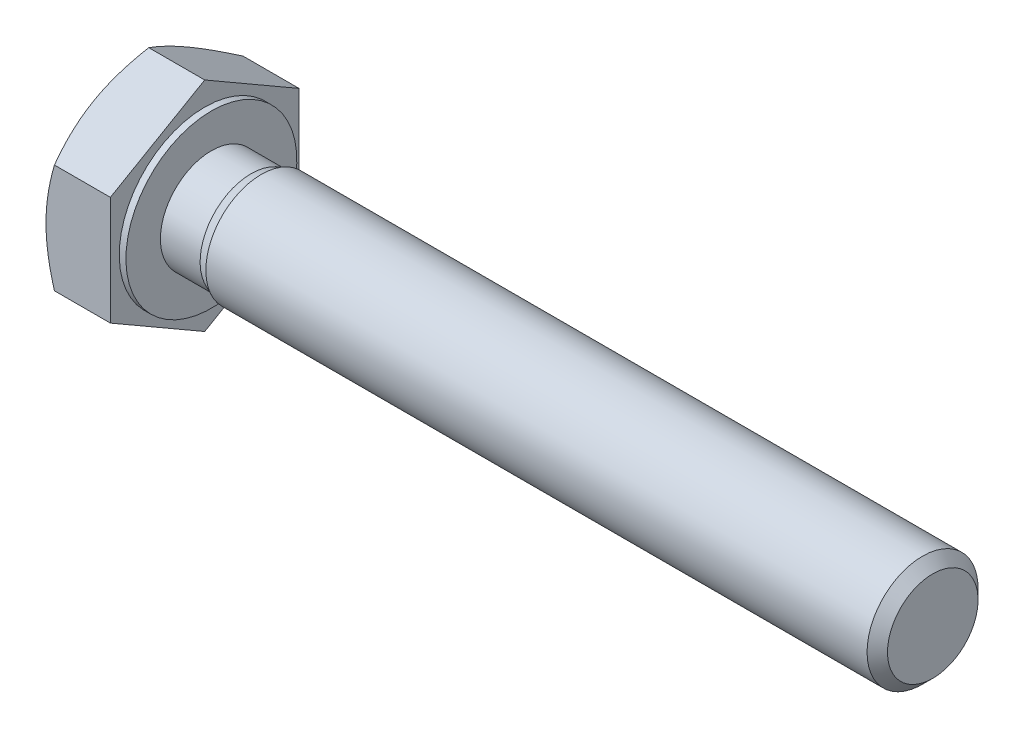
ISO-10303-21;
HEADER;
FILE_DESCRIPTION(('STEP AP214'),'2;1');
FILE_NAME('part.step','',(''),(''),'','','');
FILE_SCHEMA(('AUTOMOTIVE_DESIGN { 1 0 10303 214 1 1 1 1 }'));
ENDSEC;
DATA;
#1=APPLICATION_CONTEXT('core data for automotive mechanical design processes');
#2=APPLICATION_PROTOCOL_DEFINITION('international standard','automotive_design',2000,#1);
#3=PRODUCT_CONTEXT('',#1,'mechanical');
#4=PRODUCT('Part','Part','',(#3));
#5=PRODUCT_RELATED_PRODUCT_CATEGORY('part','',(#4));
#6=PRODUCT_DEFINITION_FORMATION('','',#4);
#7=PRODUCT_DEFINITION_CONTEXT('part definition',#1,'design');
#8=PRODUCT_DEFINITION('design','',#6,#7);
#9=PRODUCT_DEFINITION_SHAPE('','',#8);
#10=(LENGTH_UNIT() NAMED_UNIT(*) SI_UNIT(.MILLI.,.METRE.));
#11=(NAMED_UNIT(*) PLANE_ANGLE_UNIT() SI_UNIT($,.RADIAN.));
#12=(NAMED_UNIT(*) SI_UNIT($,.STERADIAN.) SOLID_ANGLE_UNIT());
#13=UNCERTAINTY_MEASURE_WITH_UNIT(LENGTH_MEASURE(1.E-05),#10,'distance_accuracy_value','');
#14=(GEOMETRIC_REPRESENTATION_CONTEXT(3) GLOBAL_UNCERTAINTY_ASSIGNED_CONTEXT((#13)) GLOBAL_UNIT_ASSIGNED_CONTEXT((#10,
#11,#12)) REPRESENTATION_CONTEXT('',''));
#15=CARTESIAN_POINT('',(0.,0.,0.));
#16=DIRECTION('',(0.,0.,1.));
#17=DIRECTION('',(1.,0.,0.));
#18=AXIS2_PLACEMENT_3D('',#15,#16,#17);
#19=CARTESIAN_POINT('',(-6.40009999999999,0.,0.));
#20=DIRECTION('',(1.,0.,0.));
#21=DIRECTION('',(0.,1.,0.));
#22=AXIS2_PLACEMENT_3D('',#19,#20,#21);
#23=PLANE('',#22);
#24=CARTESIAN_POINT('',(-6.40010000000001,0.,0.));
#25=DIRECTION('',(1.,0.,0.));
#26=DIRECTION('',(0.,0.,-1.));
#27=AXIS2_PLACEMENT_3D('',#24,#25,#26);
#28=CIRCLE('',#27,8.49999999999999);
#29=CARTESIAN_POINT('',(-6.40010000000001,7.36121593216772,-4.24999999999999));
#30=VERTEX_POINT('',#29);
#31=CARTESIAN_POINT('',(-6.40010000000001,7.36121593216772,4.25));
#32=VERTEX_POINT('',#31);
#33=EDGE_CURVE('E372',#30,#32,#28,.T.);
#34=ORIENTED_EDGE('',*,*,#33,.F.);
#35=CARTESIAN_POINT('',(-6.40010000000001,0.,0.));
#36=DIRECTION('',(1.,0.,0.));
#37=DIRECTION('',(0.,0.,-1.));
#38=AXIS2_PLACEMENT_3D('',#35,#36,#37);
#39=CIRCLE('',#38,8.49999999999999);
#40=CARTESIAN_POINT('',(-6.40010000000001,0.,-8.49999999999999));
#41=VERTEX_POINT('',#40);
#42=EDGE_CURVE('E368',#41,#30,#39,.T.);
#43=ORIENTED_EDGE('',*,*,#42,.F.);
#44=CARTESIAN_POINT('',(-6.40010000000001,0.,0.));
#45=DIRECTION('',(1.,0.,0.));
#46=DIRECTION('',(0.,0.,-1.));
#47=AXIS2_PLACEMENT_3D('',#44,#45,#46);
#48=CIRCLE('',#47,8.49999999999999);
#49=CARTESIAN_POINT('',(-6.40010000000001,-7.36121593216772,-4.25));
#50=VERTEX_POINT('',#49);
#51=EDGE_CURVE('E364',#50,#41,#48,.T.);
#52=ORIENTED_EDGE('',*,*,#51,.F.);
#53=CARTESIAN_POINT('',(-6.40010000000001,0.,0.));
#54=DIRECTION('',(1.,0.,0.));
#55=DIRECTION('',(0.,0.,-1.));
#56=AXIS2_PLACEMENT_3D('',#53,#54,#55);
#57=CIRCLE('',#56,8.49999999999999);
#58=CARTESIAN_POINT('',(-6.40010000000001,-7.36121593216773,4.24999999999999));
#59=VERTEX_POINT('',#58);
#60=EDGE_CURVE('E91',#59,#50,#57,.T.);
#61=ORIENTED_EDGE('',*,*,#60,.F.);
#62=CARTESIAN_POINT('',(-6.40010000000001,0.,0.));
#63=DIRECTION('',(1.,0.,0.));
#64=DIRECTION('',(0.,0.,-1.));
#65=AXIS2_PLACEMENT_3D('',#62,#63,#64);
#66=CIRCLE('',#65,8.49999999999999);
#67=CARTESIAN_POINT('',(-6.40010000000001,0.,8.49999999999999));
#68=VERTEX_POINT('',#67);
#69=EDGE_CURVE('E88',#68,#59,#66,.T.);
#70=ORIENTED_EDGE('',*,*,#69,.F.);
#71=CARTESIAN_POINT('',(-6.40010000000001,0.,0.));
#72=DIRECTION('',(1.,0.,0.));
#73=DIRECTION('',(0.,0.,-1.));
#74=AXIS2_PLACEMENT_3D('',#71,#72,#73);
#75=CIRCLE('',#74,8.49999999999999);
#76=EDGE_CURVE('E20',#32,#68,#75,.T.);
#77=ORIENTED_EDGE('',*,*,#76,.F.);
#78=EDGE_LOOP('',(#34,#43,#52,#61,#70,#77));
#79=FACE_BOUND('',#78,.T.);
#80=ADVANCED_FACE('F17',(#79),#23,.F.);
#81=CARTESIAN_POINT('',(-5.63635548517385,0.,0.));
#82=DIRECTION('',(1.,0.,0.));
#83=DIRECTION('',(0.,0.,-1.));
#84=AXIS2_PLACEMENT_3D('',#81,#82,#83);
#85=CONICAL_SURFACE('',#84,9.82284430368096,1.0471975511966);
#86=ORIENTED_EDGE('',*,*,#76,.T.);
#87=CARTESIAN_POINT('',(-5.64091062144517,4.90747728811179,8.5));
#88=CARTESIAN_POINT('',(-5.75625561427077,4.50801072781283,8.5));
#89=CARTESIAN_POINT('',(-5.86193176552784,4.10534509574864,8.5));
#90=CARTESIAN_POINT('',(-6.04828975558869,3.29646437388338,8.5));
#91=CARTESIAN_POINT('',(-6.12909518583168,2.89027749857132,8.5));
#92=CARTESIAN_POINT('',(-6.22831053518057,2.27716376729255,8.5));
#93=CARTESIAN_POINT('',(-6.25772889634085,2.07201802968809,8.5));
#94=CARTESIAN_POINT('',(-6.30865269274857,1.66074443821209,8.5));
#95=CARTESIAN_POINT('',(-6.33015833626476,1.45461661033458,8.5));
#96=CARTESIAN_POINT('',(-6.36487884359466,1.04061639698707,8.5));
#97=CARTESIAN_POINT('',(-6.37805154526193,0.83274044836006,8.5));
#98=CARTESIAN_POINT('',(-6.39568035620301,0.416579726441347,8.5));
#99=CARTESIAN_POINT('',(-6.40013473918327,0.208294880355975,8.5));
#100=CARTESIAN_POINT('',(-6.40010000000001,0.,8.5));
#101=B_SPLINE_CURVE_WITH_KNOTS('',3,(#87,#88,#89,#90,#91,#92,#93,#94,#95,#96,#97,#98,#99,#100),
.UNSPECIFIED.,.F.,.F.,(4,2,2,2,2,2,4),(0.,1.24786231926414,2.48941953510568,3.11101273432829,
3.73258957157481,4.35728675972873,4.98210763017936),.UNSPECIFIED.);
#102=CARTESIAN_POINT('',(-5.64091062144517,4.90747728811179,8.5));
#103=VERTEX_POINT('',#102);
#104=EDGE_CURVE('E109',#103,#68,#101,.T.);
#105=ORIENTED_EDGE('',*,*,#104,.F.);
#106=CARTESIAN_POINT('',(-6.40010000000001,7.36121593216772,4.25));
#107=CARTESIAN_POINT('',(-6.40013473918327,7.25706849198973,4.43038865786652));
#108=CARTESIAN_POINT('',(-6.39568035620302,7.15292606894704,4.61076862579978));
#109=CARTESIAN_POINT('',(-6.37805154526193,6.94484570798768,4.97117438303866));
#110=CARTESIAN_POINT('',(-6.36487884359466,6.84090773367418,5.15120023538544));
#111=CARTESIAN_POINT('',(-6.33015833626476,6.63390762700042,5.50973493731657));
#112=CARTESIAN_POINT('',(-6.30865269274857,6.53084371306166,5.6882468726854));
#113=CARTESIAN_POINT('',(-6.25772889634085,6.32520691732366,6.04442025080929));
#114=CARTESIAN_POINT('',(-6.22831053518057,6.22263404852143,6.22208167105284));
#115=CARTESIAN_POINT('',(-6.12909518583168,5.91607718288204,6.75305373774932));
#116=CARTESIAN_POINT('',(-6.04828975558869,5.71298374522601,7.10482189045339));
#117=CARTESIAN_POINT('',(-5.86193176552784,5.30854338429338,7.80533314422021));
#118=CARTESIAN_POINT('',(-5.75625561427076,5.10721056826128,8.15405181081872));
#119=CARTESIAN_POINT('',(-5.64091062144517,4.9074772881118,8.50000000000001));
#120=B_SPLINE_CURVE_WITH_KNOTS('',3,(#106,#107,#108,#109,#110,#111,#112,#113,#114,#115,#116,
#117,#118,#119),.UNSPECIFIED.,.F.,.F.,(4,2,2,2,2,2,4),(0.,0.624820870450639,1.24951805860457,
1.87109489585109,2.4926880950737,3.73424531091525,4.9821076301794),.UNSPECIFIED.);
#121=EDGE_CURVE('E103',#32,#103,#120,.T.);
#122=ORIENTED_EDGE('',*,*,#121,.F.);
#123=EDGE_LOOP('',(#86,#105,#122));
#124=FACE_BOUND('',#123,.T.);
#125=ADVANCED_FACE('F108',(#124),#85,.T.);
#126=CARTESIAN_POINT('',(-5.63635548517385,0.,0.));
#127=DIRECTION('',(1.,0.,0.));
#128=DIRECTION('',(0.,0.,-1.));
#129=AXIS2_PLACEMENT_3D('',#126,#127,#128);
#130=CONICAL_SURFACE('',#129,9.82284430368095,1.0471975511966);
#131=CARTESIAN_POINT('',(-6.40010000000001,0.,8.5));
#132=CARTESIAN_POINT('',(-6.40013473918327,-0.208294880355988,8.49999999999999));
#133=CARTESIAN_POINT('',(-6.39568035620301,-0.416579726441361,8.49999999999999));
#134=CARTESIAN_POINT('',(-6.37805154526193,-0.832740448360073,8.49999999999999));
#135=CARTESIAN_POINT('',(-6.36487884359466,-1.04061639698708,8.49999999999999));
#136=CARTESIAN_POINT('',(-6.33015833626476,-1.45461661033459,8.49999999999999));
#137=CARTESIAN_POINT('',(-6.30865269274857,-1.66074443821211,8.49999999999999));
#138=CARTESIAN_POINT('',(-6.25772889634085,-2.07201802968811,8.49999999999999));
#139=CARTESIAN_POINT('',(-6.22831053518057,-2.27716376729256,8.49999999999999));
#140=CARTESIAN_POINT('',(-6.12909518583168,-2.89027749857133,8.49999999999999));
#141=CARTESIAN_POINT('',(-6.04828975558869,-3.29646437388339,8.49999999999999));
#142=CARTESIAN_POINT('',(-5.86193176552784,-4.10534509574865,8.49999999999999));
#143=CARTESIAN_POINT('',(-5.75625561427077,-4.50801072781284,8.49999999999999));
#144=CARTESIAN_POINT('',(-5.64091062144517,-4.9074772881118,8.49999999999999));
#145=B_SPLINE_CURVE_WITH_KNOTS('',3,(#131,#132,#133,#134,#135,#136,#137,#138,#139,#140,#141,
#142,#143,#144),.UNSPECIFIED.,.F.,.F.,(4,2,2,2,2,2,4),(0.,0.624820870450634,1.24951805860456,
1.87109489585108,2.49268809507368,3.73424531091522,4.98210763017936),.UNSPECIFIED.);
#146=CARTESIAN_POINT('',(-5.64091062144517,-4.90747728811181,8.5));
#147=VERTEX_POINT('',#146);
#148=EDGE_CURVE('E96',#68,#147,#145,.T.);
#149=ORIENTED_EDGE('',*,*,#148,.F.);
#150=ORIENTED_EDGE('',*,*,#69,.T.);
#151=CARTESIAN_POINT('',(-5.64091062144516,-4.90747728811182,8.5));
#152=CARTESIAN_POINT('',(-5.75625561427076,-5.1072105682613,8.15405181081871));
#153=CARTESIAN_POINT('',(-5.86193176552783,-5.30854338429339,7.8053331442202));
#154=CARTESIAN_POINT('',(-6.04828975558869,-5.71298374522603,7.10482189045339));
#155=CARTESIAN_POINT('',(-6.12909518583168,-5.91607718288206,6.75305373774932));
#156=CARTESIAN_POINT('',(-6.22831053518057,-6.22263404852144,6.22208167105283));
#157=CARTESIAN_POINT('',(-6.25772889634085,-6.32520691732367,6.04442025080928));
#158=CARTESIAN_POINT('',(-6.30865269274857,-6.53084371306167,5.6882468726854));
#159=CARTESIAN_POINT('',(-6.33015833626475,-6.63390762700043,5.50973493731656));
#160=CARTESIAN_POINT('',(-6.36487884359466,-6.84090773367419,5.15120023538544));
#161=CARTESIAN_POINT('',(-6.37805154526193,-6.94484570798769,4.97117438303866));
#162=CARTESIAN_POINT('',(-6.39568035620301,-7.15292606894705,4.61076862579978));
#163=CARTESIAN_POINT('',(-6.40013473918327,-7.25706849198974,4.43038865786651));
#164=CARTESIAN_POINT('',(-6.40010000000001,-7.36121593216773,4.24999999999999));
#165=B_SPLINE_CURVE_WITH_KNOTS('',3,(#151,#152,#153,#154,#155,#156,#157,#158,#159,#160,#161,
#162,#163,#164),.UNSPECIFIED.,.F.,.F.,(4,2,2,2,2,2,4),(0.,1.24786231926415,2.4894195351057,
3.11101273432831,3.73258957157484,4.35728675972876,4.9821076301794),.UNSPECIFIED.);
#166=EDGE_CURVE('E98',#147,#59,#165,.T.);
#167=ORIENTED_EDGE('',*,*,#166,.F.);
#168=EDGE_LOOP('',(#149,#150,#167));
#169=FACE_BOUND('',#168,.T.);
#170=ADVANCED_FACE('F97',(#169),#130,.T.);
#171=CARTESIAN_POINT('',(-5.63635548517385,0.,0.));
#172=DIRECTION('',(1.,0.,0.));
#173=DIRECTION('',(0.,0.,-1.));
#174=AXIS2_PLACEMENT_3D('',#171,#172,#173);
#175=CONICAL_SURFACE('',#174,9.82284430368096,1.0471975511966);
#176=CARTESIAN_POINT('',(-6.40010000000001,-7.36121593216773,4.24999999999999));
#177=CARTESIAN_POINT('',(-6.40013473918327,-7.46536337234572,4.06961134213347));
#178=CARTESIAN_POINT('',(-6.39568035620301,-7.56950579538841,3.88923137420021));
#179=CARTESIAN_POINT('',(-6.37805154526193,-7.77758615634776,3.52882561696133));
#180=CARTESIAN_POINT('',(-6.36487884359466,-7.88152413066127,3.34879976461455));
#181=CARTESIAN_POINT('',(-6.33015833626476,-8.08852423733502,2.99026506268343));
#182=CARTESIAN_POINT('',(-6.30865269274857,-8.19158815127378,2.8117531273146));
#183=CARTESIAN_POINT('',(-6.25772889634085,-8.39722494701178,2.45557974919072));
#184=CARTESIAN_POINT('',(-6.22831053518057,-8.499797815814,2.27791832894716));
#185=CARTESIAN_POINT('',(-6.12909518583168,-8.80635468145339,1.74694626225068));
#186=CARTESIAN_POINT('',(-6.04828975558869,-9.00944811910942,1.39517810954662));
#187=CARTESIAN_POINT('',(-5.86193176552784,-9.41388848004205,0.694666855779806));
#188=CARTESIAN_POINT('',(-5.75625561427076,-9.61522129607414,0.345948189181299));
#189=CARTESIAN_POINT('',(-5.64091062144517,-9.81495457622363,0.));
#190=B_SPLINE_CURVE_WITH_KNOTS('',3,(#176,#177,#178,#179,#180,#181,#182,#183,#184,#185,#186,
#187,#188,#189),.UNSPECIFIED.,.F.,.F.,(4,2,2,2,2,2,4),(0.,0.624820870450635,1.24951805860456,
1.87109489585108,2.49268809507368,3.73424531091522,4.98210763017936),.UNSPECIFIED.);
#191=CARTESIAN_POINT('',(-5.64091062144517,-9.81495457622363,0.));
#192=VERTEX_POINT('',#191);
#193=EDGE_CURVE('E114',#59,#192,#190,.T.);
#194=ORIENTED_EDGE('',*,*,#193,.F.);
#195=ORIENTED_EDGE('',*,*,#60,.T.);
#196=CARTESIAN_POINT('',(-5.64091062144516,-9.81495457622364,0.));
#197=CARTESIAN_POINT('',(-5.75625561427076,-9.61522129607416,-0.345948189181284));
#198=CARTESIAN_POINT('',(-5.86193176552783,-9.41388848004206,-0.694666855779793));
#199=CARTESIAN_POINT('',(-6.04828975558869,-9.00944811910943,-1.39517810954661));
#200=CARTESIAN_POINT('',(-6.12909518583168,-8.8063546814534,-1.74694626225068));
#201=CARTESIAN_POINT('',(-6.22831053518057,-8.49979781581401,-2.27791832894716));
#202=CARTESIAN_POINT('',(-6.25772889634085,-8.39722494701178,-2.45557974919071));
#203=CARTESIAN_POINT('',(-6.30865269274857,-8.19158815127378,-2.8117531273146));
#204=CARTESIAN_POINT('',(-6.33015833626475,-8.08852423733502,-2.99026506268343));
#205=CARTESIAN_POINT('',(-6.36487884359466,-7.88152413066126,-3.34879976461456));
#206=CARTESIAN_POINT('',(-6.37805154526193,-7.77758615634776,-3.52882561696133));
#207=CARTESIAN_POINT('',(-6.39568035620301,-7.5695057953884,-3.88923137420021));
#208=CARTESIAN_POINT('',(-6.40013473918327,-7.46536337234571,-4.06961134213348));
#209=CARTESIAN_POINT('',(-6.40010000000001,-7.36121593216772,-4.25));
#210=B_SPLINE_CURVE_WITH_KNOTS('',3,(#196,#197,#198,#199,#200,#201,#202,#203,#204,#205,#206,
#207,#208,#209),.UNSPECIFIED.,.F.,.F.,(4,2,2,2,2,2,4),(0.,1.24786231926415,2.4894195351057,
3.11101273432831,3.73258957157483,4.35728675972876,4.9821076301794),.UNSPECIFIED.);
#211=EDGE_CURVE('E208',#192,#50,#210,.T.);
#212=ORIENTED_EDGE('',*,*,#211,.F.);
#213=EDGE_LOOP('',(#194,#195,#212));
#214=FACE_BOUND('',#213,.T.);
#215=ADVANCED_FACE('F216',(#214),#175,.T.);
#216=CARTESIAN_POINT('',(-5.63635548517385,0.,0.));
#217=DIRECTION('',(1.,0.,0.));
#218=DIRECTION('',(0.,0.,-1.));
#219=AXIS2_PLACEMENT_3D('',#216,#217,#218);
#220=CONICAL_SURFACE('',#219,9.82284430368096,1.0471975511966);
#221=CARTESIAN_POINT('',(-6.40010000000001,-7.36121593216772,-4.25));
#222=CARTESIAN_POINT('',(-6.40013473918327,-7.25706849198973,-4.43038865786652));
#223=CARTESIAN_POINT('',(-6.39568035620302,-7.15292606894704,-4.61076862579978));
#224=CARTESIAN_POINT('',(-6.37805154526193,-6.94484570798769,-4.97117438303866));
#225=CARTESIAN_POINT('',(-6.36487884359466,-6.84090773367419,-5.15120023538544));
#226=CARTESIAN_POINT('',(-6.33015833626476,-6.63390762700043,-5.50973493731656));
#227=CARTESIAN_POINT('',(-6.30865269274857,-6.53084371306167,-5.68824687268539));
#228=CARTESIAN_POINT('',(-6.25772889634085,-6.32520691732367,-6.04442025080928));
#229=CARTESIAN_POINT('',(-6.22831053518057,-6.22263404852144,-6.22208167105283));
#230=CARTESIAN_POINT('',(-6.12909518583168,-5.91607718288206,-6.75305373774931));
#231=CARTESIAN_POINT('',(-6.04828975558869,-5.71298374522603,-7.10482189045338));
#232=CARTESIAN_POINT('',(-5.86193176552784,-5.3085433842934,-7.80533314422019));
#233=CARTESIAN_POINT('',(-5.75625561427077,-5.1072105682613,-8.15405181081869));
#234=CARTESIAN_POINT('',(-5.64091062144517,-4.90747728811182,-8.49999999999998));
#235=B_SPLINE_CURVE_WITH_KNOTS('',3,(#221,#222,#223,#224,#225,#226,#227,#228,#229,#230,#231,
#232,#233,#234),.UNSPECIFIED.,.F.,.F.,(4,2,2,2,2,2,4),(0.,0.624820870450634,1.24951805860456,
1.87109489585108,2.49268809507368,3.73424531091522,4.98210763017937),.UNSPECIFIED.);
#236=CARTESIAN_POINT('',(-5.64091062144517,-4.90747728811182,-8.49999999999999));
#237=VERTEX_POINT('',#236);
#238=EDGE_CURVE('E220',#50,#237,#235,.T.);
#239=ORIENTED_EDGE('',*,*,#238,.F.);
#240=ORIENTED_EDGE('',*,*,#51,.T.);
#241=CARTESIAN_POINT('',(-5.64091062144516,-4.90747728811182,-8.5));
#242=CARTESIAN_POINT('',(-5.75625561427075,-4.50801072781286,-8.5));
#243=CARTESIAN_POINT('',(-5.86193176552783,-4.10534509574867,-8.5));
#244=CARTESIAN_POINT('',(-6.04828975558869,-3.2964643738834,-8.5));
#245=CARTESIAN_POINT('',(-6.12909518583168,-2.89027749857134,-8.5));
#246=CARTESIAN_POINT('',(-6.22831053518057,-2.27716376729257,-8.5));
#247=CARTESIAN_POINT('',(-6.25772889634084,-2.07201802968811,-8.5));
#248=CARTESIAN_POINT('',(-6.30865269274857,-1.66074443821211,-8.5));
#249=CARTESIAN_POINT('',(-6.33015833626475,-1.4546166103346,-8.5));
#250=CARTESIAN_POINT('',(-6.36487884359466,-1.04061639698708,-8.5));
#251=CARTESIAN_POINT('',(-6.37805154526192,-0.832740448360071,-8.5));
#252=CARTESIAN_POINT('',(-6.39568035620301,-0.416579726441356,-8.5));
#253=CARTESIAN_POINT('',(-6.40013473918327,-0.208294880355983,-8.5));
#254=CARTESIAN_POINT('',(-6.40010000000001,0.,-8.5));
#255=B_SPLINE_CURVE_WITH_KNOTS('',3,(#241,#242,#243,#244,#245,#246,#247,#248,#249,#250,#251,
#252,#253,#254),.UNSPECIFIED.,.F.,.F.,(4,2,2,2,2,2,4),(0.,1.24786231926415,2.4894195351057,
3.11101273432831,3.73258957157483,4.35728675972876,4.9821076301794),.UNSPECIFIED.);
#256=EDGE_CURVE('E202',#237,#41,#255,.T.);
#257=ORIENTED_EDGE('',*,*,#256,.F.);
#258=EDGE_LOOP('',(#239,#240,#257));
#259=FACE_BOUND('',#258,.T.);
#260=ADVANCED_FACE('F213',(#259),#220,.T.);
#261=CARTESIAN_POINT('',(-5.63635548517385,0.,0.));
#262=DIRECTION('',(1.,0.,0.));
#263=DIRECTION('',(0.,0.,-1.));
#264=AXIS2_PLACEMENT_3D('',#261,#262,#263);
#265=CONICAL_SURFACE('',#264,9.82284430368095,1.0471975511966);
#266=ORIENTED_EDGE('',*,*,#42,.T.);
#267=CARTESIAN_POINT('',(-5.64091062144516,4.90747728811181,-8.5));
#268=CARTESIAN_POINT('',(-5.75625561427076,5.1072105682613,-8.15405181081871));
#269=CARTESIAN_POINT('',(-5.86193176552783,5.30854338429339,-7.8053331442202));
#270=CARTESIAN_POINT('',(-6.04828975558869,5.71298374522602,-7.10482189045339));
#271=CARTESIAN_POINT('',(-6.12909518583168,5.91607718288206,-6.75305373774932));
#272=CARTESIAN_POINT('',(-6.22831053518057,6.22263404852144,-6.22208167105283));
#273=CARTESIAN_POINT('',(-6.25772889634085,6.32520691732367,-6.04442025080928));
#274=CARTESIAN_POINT('',(-6.30865269274857,6.53084371306167,-5.6882468726854));
#275=CARTESIAN_POINT('',(-6.33015833626476,6.63390762700043,-5.50973493731656));
#276=CARTESIAN_POINT('',(-6.36487884359466,6.84090773367419,-5.15120023538544));
#277=CARTESIAN_POINT('',(-6.37805154526193,6.94484570798769,-4.97117438303866));
#278=CARTESIAN_POINT('',(-6.39568035620301,7.15292606894705,-4.61076862579978));
#279=CARTESIAN_POINT('',(-6.40013473918327,7.25706849198974,-4.43038865786651));
#280=CARTESIAN_POINT('',(-6.40010000000001,7.36121593216773,-4.24999999999999));
#281=B_SPLINE_CURVE_WITH_KNOTS('',3,(#267,#268,#269,#270,#271,#272,#273,#274,#275,#276,#277,
#278,#279,#280),.UNSPECIFIED.,.F.,.F.,(4,2,2,2,2,2,4),(0.,1.24786231926415,2.4894195351057,
3.11101273432831,3.73258957157483,4.35728675972876,4.9821076301794),.UNSPECIFIED.);
#282=CARTESIAN_POINT('',(-5.64091062144517,4.90747728811181,-8.5));
#283=VERTEX_POINT('',#282);
#284=EDGE_CURVE('E174',#283,#30,#281,.T.);
#285=ORIENTED_EDGE('',*,*,#284,.F.);
#286=CARTESIAN_POINT('',(-6.40010000000001,0.,-8.5));
#287=CARTESIAN_POINT('',(-6.40013473918327,0.208294880355983,-8.5));
#288=CARTESIAN_POINT('',(-6.39568035620301,0.416579726441355,-8.5));
#289=CARTESIAN_POINT('',(-6.37805154526192,0.832740448360068,-8.5));
#290=CARTESIAN_POINT('',(-6.36487884359466,1.04061639698707,-8.5));
#291=CARTESIAN_POINT('',(-6.33015833626475,1.45461661033459,-8.5));
#292=CARTESIAN_POINT('',(-6.30865269274857,1.6607444382121,-8.5));
#293=CARTESIAN_POINT('',(-6.25772889634085,2.0720180296881,-8.5));
#294=CARTESIAN_POINT('',(-6.22831053518057,2.27716376729256,-8.5));
#295=CARTESIAN_POINT('',(-6.12909518583168,2.89027749857133,-8.5));
#296=CARTESIAN_POINT('',(-6.04828975558869,3.29646437388339,-8.5));
#297=CARTESIAN_POINT('',(-5.86193176552784,4.10534509574865,-8.5));
#298=CARTESIAN_POINT('',(-5.75625561427076,4.50801072781284,-8.49999999999999));
#299=CARTESIAN_POINT('',(-5.64091062144517,4.9074772881118,-8.5));
#300=B_SPLINE_CURVE_WITH_KNOTS('',3,(#286,#287,#288,#289,#290,#291,#292,#293,#294,#295,#296,
#297,#298,#299),.UNSPECIFIED.,.F.,.F.,(4,2,2,2,2,2,4),(0.,0.624820870450635,1.24951805860456,
1.87109489585108,2.49268809507368,3.73424531091522,4.98210763017937),.UNSPECIFIED.);
#301=EDGE_CURVE('E197',#41,#283,#300,.T.);
#302=ORIENTED_EDGE('',*,*,#301,.F.);
#303=EDGE_LOOP('',(#266,#285,#302));
#304=FACE_BOUND('',#303,.T.);
#305=ADVANCED_FACE('F159',(#304),#265,.T.);
#306=CARTESIAN_POINT('',(-5.63635548517385,0.,0.));
#307=DIRECTION('',(1.,0.,0.));
#308=DIRECTION('',(0.,0.,-1.));
#309=AXIS2_PLACEMENT_3D('',#306,#307,#308);
#310=CONICAL_SURFACE('',#309,9.82284430368096,1.0471975511966);
#311=ORIENTED_EDGE('',*,*,#33,.T.);
#312=CARTESIAN_POINT('',(-5.64091062144517,9.81495457622363,0.));
#313=CARTESIAN_POINT('',(-5.75625561427076,9.61522129607415,0.345948189181294));
#314=CARTESIAN_POINT('',(-5.86193176552784,9.41388848004206,0.694666855779801));
#315=CARTESIAN_POINT('',(-6.04828975558869,9.00944811910942,1.39517810954661));
#316=CARTESIAN_POINT('',(-6.12909518583168,8.80635468145339,1.74694626225068));
#317=CARTESIAN_POINT('',(-6.22831053518057,8.499797815814,2.27791832894716));
#318=CARTESIAN_POINT('',(-6.25772889634085,8.39722494701178,2.45557974919072));
#319=CARTESIAN_POINT('',(-6.30865269274857,8.19158815127378,2.8117531273146));
#320=CARTESIAN_POINT('',(-6.33015833626476,8.08852423733502,2.99026506268343));
#321=CARTESIAN_POINT('',(-6.36487884359466,7.88152413066126,3.34879976461456));
#322=CARTESIAN_POINT('',(-6.37805154526193,7.77758615634776,3.52882561696134));
#323=CARTESIAN_POINT('',(-6.39568035620301,7.5695057953884,3.88923137420021));
#324=CARTESIAN_POINT('',(-6.40013473918327,7.46536337234571,4.06961134213348));
#325=CARTESIAN_POINT('',(-6.40010000000001,7.36121593216772,4.25));
#326=B_SPLINE_CURVE_WITH_KNOTS('',3,(#312,#313,#314,#315,#316,#317,#318,#319,#320,#321,#322,
#323,#324,#325),.UNSPECIFIED.,.F.,.F.,(4,2,2,2,2,2,4),(0.,1.24786231926415,2.48941953510569,
3.1110127343283,3.73258957157482,4.35728675972875,4.98210763017939),.UNSPECIFIED.);
#327=CARTESIAN_POINT('',(-5.64091062144517,9.81495457622363,0.));
#328=VERTEX_POINT('',#327);
#329=EDGE_CURVE('E144',#328,#32,#326,.T.);
#330=ORIENTED_EDGE('',*,*,#329,.F.);
#331=CARTESIAN_POINT('',(-6.40010000000001,7.36121593216773,-4.24999999999999));
#332=CARTESIAN_POINT('',(-6.40013473918327,7.46536337234572,-4.06961134213347));
#333=CARTESIAN_POINT('',(-6.39568035620302,7.5695057953884,-3.88923137420021));
#334=CARTESIAN_POINT('',(-6.37805154526193,7.77758615634776,-3.52882561696133));
#335=CARTESIAN_POINT('',(-6.36487884359466,7.88152413066127,-3.34879976461455));
#336=CARTESIAN_POINT('',(-6.33015833626476,8.08852423733502,-2.99026506268343));
#337=CARTESIAN_POINT('',(-6.30865269274857,8.19158815127378,-2.81175312731459));
#338=CARTESIAN_POINT('',(-6.25772889634085,8.39722494701178,-2.45557974919071));
#339=CARTESIAN_POINT('',(-6.22831053518057,8.499797815814,-2.27791832894716));
#340=CARTESIAN_POINT('',(-6.12909518583168,8.80635468145339,-1.74694626225068));
#341=CARTESIAN_POINT('',(-6.04828975558869,9.00944811910942,-1.39517810954661));
#342=CARTESIAN_POINT('',(-5.86193176552784,9.41388848004206,-0.694666855779796));
#343=CARTESIAN_POINT('',(-5.75625561427076,9.61522129607415,-0.345948189181289));
#344=CARTESIAN_POINT('',(-5.64091062144517,9.81495457622363,0.));
#345=B_SPLINE_CURVE_WITH_KNOTS('',3,(#331,#332,#333,#334,#335,#336,#337,#338,#339,#340,#341,
#342,#343,#344),.UNSPECIFIED.,.F.,.F.,(4,2,2,2,2,2,4),(0.,0.624820870450637,1.24951805860456,
1.87109489585108,2.49268809507369,3.73424531091523,4.98210763017938),.UNSPECIFIED.);
#346=EDGE_CURVE('E165',#30,#328,#345,.T.);
#347=ORIENTED_EDGE('',*,*,#346,.F.);
#348=EDGE_LOOP('',(#311,#330,#347));
#349=FACE_BOUND('',#348,.T.);
#350=ADVANCED_FACE('F153',(#349),#310,.T.);
#351=CARTESIAN_POINT('',(-0.600099999999995,9.81495457622363,0.));
#352=DIRECTION('',(0.,0.866025403784438,0.500000000000001));
#353=DIRECTION('',(0.,-0.500000000000001,0.866025403784438));
#354=AXIS2_PLACEMENT_3D('',#351,#352,#353);
#355=PLANE('',#354);
#356=DIRECTION('',(0.,-0.500000000000001,0.866025403784438));
#357=VECTOR('',#356,1.);
#358=CARTESIAN_POINT('',(-0.600099999999995,9.81495457622363,0.));
#359=LINE('',#358,#357);
#360=CARTESIAN_POINT('',(-0.600099999999995,9.81495457622363,0.));
#361=VERTEX_POINT('',#360);
#362=CARTESIAN_POINT('',(-0.600099999999994,4.90747728811181,8.5));
#363=VERTEX_POINT('',#362);
#364=EDGE_CURVE('E296',#361,#363,#359,.T.);
#365=ORIENTED_EDGE('',*,*,#364,.F.);
#366=DIRECTION('',(1.,0.,0.));
#367=VECTOR('',#366,1.);
#368=CARTESIAN_POINT('',(-0.600099999999995,9.81495457622363,0.));
#369=LINE('',#368,#367);
#370=EDGE_CURVE('E173',#328,#361,#369,.T.);
#371=ORIENTED_EDGE('',*,*,#370,.F.);
#372=ORIENTED_EDGE('',*,*,#329,.T.);
#373=ORIENTED_EDGE('',*,*,#121,.T.);
#374=DIRECTION('',(1.,0.,0.));
#375=VECTOR('',#374,1.);
#376=CARTESIAN_POINT('',(-0.600099999999995,4.90747728811181,8.5));
#377=LINE('',#376,#375);
#378=EDGE_CURVE('E102',#363,#103,#377,.F.);
#379=ORIENTED_EDGE('',*,*,#378,.F.);
#380=EDGE_LOOP('',(#365,#371,#372,#373,#379));
#381=FACE_BOUND('',#380,.T.);
#382=ADVANCED_FACE('F150',(#381),#355,.T.);
#383=CARTESIAN_POINT('',(-0.600099999999995,4.90747728811181,8.5));
#384=DIRECTION('',(0.,0.,1.));
#385=DIRECTION('',(0.,-1.,0.));
#386=AXIS2_PLACEMENT_3D('',#383,#384,#385);
#387=PLANE('',#386);
#388=ORIENTED_EDGE('',*,*,#378,.T.);
#389=ORIENTED_EDGE('',*,*,#104,.T.);
#390=ORIENTED_EDGE('',*,*,#148,.T.);
#391=DIRECTION('',(1.,0.,0.));
#392=VECTOR('',#391,1.);
#393=CARTESIAN_POINT('',(-0.600099999999993,-4.90747728811182,8.49999999999999));
#394=LINE('',#393,#392);
#395=CARTESIAN_POINT('',(-0.600099999999993,-4.90747728811182,8.49999999999999));
#396=VERTEX_POINT('',#395);
#397=EDGE_CURVE('E116',#396,#147,#394,.F.);
#398=ORIENTED_EDGE('',*,*,#397,.F.);
#399=DIRECTION('',(0.,1.,0.));
#400=VECTOR('',#399,1.);
#401=CARTESIAN_POINT('',(-0.600099999999994,0.,8.5));
#402=LINE('',#401,#400);
#403=EDGE_CURVE('E292',#363,#396,#402,.F.);
#404=ORIENTED_EDGE('',*,*,#403,.F.);
#405=EDGE_LOOP('',(#388,#389,#390,#398,#404));
#406=FACE_BOUND('',#405,.T.);
#407=ADVANCED_FACE('F112',(#406),#387,.T.);
#408=CARTESIAN_POINT('',(-0.600099999999993,-4.90747728811182,8.49999999999999));
#409=DIRECTION('',(0.,-0.866025403784439,0.5));
#410=DIRECTION('',(0.,-0.5,-0.866025403784439));
#411=AXIS2_PLACEMENT_3D('',#408,#409,#410);
#412=PLANE('',#411);
#413=ORIENTED_EDGE('',*,*,#397,.T.);
#414=ORIENTED_EDGE('',*,*,#166,.T.);
#415=ORIENTED_EDGE('',*,*,#193,.T.);
#416=DIRECTION('',(1.,0.,0.));
#417=VECTOR('',#416,1.);
#418=CARTESIAN_POINT('',(-0.600099999999993,-9.81495457622363,0.));
#419=LINE('',#418,#417);
#420=CARTESIAN_POINT('',(-0.600099999999993,-9.81495457622363,0.));
#421=VERTEX_POINT('',#420);
#422=EDGE_CURVE('E225',#421,#192,#419,.F.);
#423=ORIENTED_EDGE('',*,*,#422,.F.);
#424=DIRECTION('',(0.,-0.499999999999999,-0.866025403784439));
#425=VECTOR('',#424,1.);
#426=CARTESIAN_POINT('',(-0.600099999999993,-4.90747728811182,8.49999999999999));
#427=LINE('',#426,#425);
#428=EDGE_CURVE('E295',#396,#421,#427,.T.);
#429=ORIENTED_EDGE('',*,*,#428,.F.);
#430=EDGE_LOOP('',(#413,#414,#415,#423,#429));
#431=FACE_BOUND('',#430,.T.);
#432=ADVANCED_FACE('F229',(#431),#412,.T.);
#433=CARTESIAN_POINT('',(-0.600099999999993,-9.81495457622363,0.));
#434=DIRECTION('',(0.,-0.866025403784438,-0.5));
#435=DIRECTION('',(0.,0.5,-0.866025403784438));
#436=AXIS2_PLACEMENT_3D('',#433,#434,#435);
#437=PLANE('',#436);
#438=ORIENTED_EDGE('',*,*,#422,.T.);
#439=ORIENTED_EDGE('',*,*,#211,.T.);
#440=ORIENTED_EDGE('',*,*,#238,.T.);
#441=DIRECTION('',(1.,0.,0.));
#442=VECTOR('',#441,1.);
#443=CARTESIAN_POINT('',(-0.600099999999993,-4.90747728811181,-8.5));
#444=LINE('',#443,#442);
#445=CARTESIAN_POINT('',(-0.600099999999994,-4.90747728811181,-8.5));
#446=VERTEX_POINT('',#445);
#447=EDGE_CURVE('E330',#446,#237,#444,.F.);
#448=ORIENTED_EDGE('',*,*,#447,.F.);
#449=DIRECTION('',(0.,0.5,-0.866025403784438));
#450=VECTOR('',#449,1.);
#451=CARTESIAN_POINT('',(-0.600099999999993,-9.81495457622363,0.));
#452=LINE('',#451,#450);
#453=EDGE_CURVE('E301',#421,#446,#452,.T.);
#454=ORIENTED_EDGE('',*,*,#453,.F.);
#455=EDGE_LOOP('',(#438,#439,#440,#448,#454));
#456=FACE_BOUND('',#455,.T.);
#457=ADVANCED_FACE('F194',(#456),#437,.T.);
#458=CARTESIAN_POINT('',(-0.600099999999993,-4.90747728811181,-8.5));
#459=DIRECTION('',(0.,0.,-1.));
#460=DIRECTION('',(0.,1.,0.));
#461=AXIS2_PLACEMENT_3D('',#458,#459,#460);
#462=PLANE('',#461);
#463=DIRECTION('',(0.,1.,0.));
#464=VECTOR('',#463,1.);
#465=CARTESIAN_POINT('',(-0.600099999999994,0.,-8.5));
#466=LINE('',#465,#464);
#467=CARTESIAN_POINT('',(-0.600099999999995,4.90747728811182,-8.49999999999999));
#468=VERTEX_POINT('',#467);
#469=EDGE_CURVE('E306',#446,#468,#466,.T.);
#470=ORIENTED_EDGE('',*,*,#469,.F.);
#471=ORIENTED_EDGE('',*,*,#447,.T.);
#472=ORIENTED_EDGE('',*,*,#256,.T.);
#473=ORIENTED_EDGE('',*,*,#301,.T.);
#474=DIRECTION('',(1.,0.,0.));
#475=VECTOR('',#474,1.);
#476=CARTESIAN_POINT('',(-0.600099999999995,4.90747728811182,-8.49999999999999));
#477=LINE('',#476,#475);
#478=EDGE_CURVE('E35',#468,#283,#477,.F.);
#479=ORIENTED_EDGE('',*,*,#478,.F.);
#480=EDGE_LOOP('',(#470,#471,#472,#473,#479));
#481=FACE_BOUND('',#480,.T.);
#482=ADVANCED_FACE('F187',(#481),#462,.T.);
#483=CARTESIAN_POINT('',(-0.600099999999995,4.90747728811182,-8.49999999999999));
#484=DIRECTION('',(0.,0.866025403784439,-0.5));
#485=DIRECTION('',(0.,0.5,0.866025403784439));
#486=AXIS2_PLACEMENT_3D('',#483,#484,#485);
#487=PLANE('',#486);
#488=DIRECTION('',(0.,0.499999999999999,0.866025403784439));
#489=VECTOR('',#488,1.);
#490=CARTESIAN_POINT('',(-0.600099999999995,4.90747728811182,-8.49999999999999));
#491=LINE('',#490,#489);
#492=EDGE_CURVE('E285',#468,#361,#491,.T.);
#493=ORIENTED_EDGE('',*,*,#492,.F.);
#494=ORIENTED_EDGE('',*,*,#478,.T.);
#495=ORIENTED_EDGE('',*,*,#284,.T.);
#496=ORIENTED_EDGE('',*,*,#346,.T.);
#497=ORIENTED_EDGE('',*,*,#370,.T.);
#498=EDGE_LOOP('',(#493,#494,#495,#496,#497));
#499=FACE_BOUND('',#498,.T.);
#500=ADVANCED_FACE('F181',(#499),#487,.T.);
#501=CARTESIAN_POINT('',(-0.600099999999994,0.,0.));
#502=DIRECTION('',(1.,0.,0.));
#503=DIRECTION('',(0.,1.,0.));
#504=AXIS2_PLACEMENT_3D('',#501,#502,#503);
#505=PLANE('',#504);
#506=CARTESIAN_POINT('',(-0.600099999999995,0.,0.));
#507=DIRECTION('',(1.,0.,0.));
#508=DIRECTION('',(0.,1.,0.));
#509=AXIS2_PLACEMENT_3D('',#506,#507,#508);
#510=CIRCLE('',#509,7.7);
#511=CARTESIAN_POINT('',(-0.600099999999996,7.7,0.));
#512=VERTEX_POINT('',#511);
#513=EDGE_CURVE('E175',#512,#512,#510,.T.);
#514=ORIENTED_EDGE('',*,*,#513,.F.);
#515=EDGE_LOOP('',(#514));
#516=FACE_BOUND('',#515,.T.);
#517=ORIENTED_EDGE('',*,*,#469,.T.);
#518=ORIENTED_EDGE('',*,*,#492,.T.);
#519=ORIENTED_EDGE('',*,*,#364,.T.);
#520=ORIENTED_EDGE('',*,*,#403,.T.);
#521=ORIENTED_EDGE('',*,*,#428,.T.);
#522=ORIENTED_EDGE('',*,*,#453,.T.);
#523=EDGE_LOOP('',(#517,#518,#519,#520,#521,#522));
#524=FACE_BOUND('',#523,.T.);
#525=ADVANCED_FACE('F186',(#516,#524),#505,.T.);
#526=CARTESIAN_POINT('',(-0.300050000000001,0.,0.));
#527=DIRECTION('',(1.,0.,0.));
#528=DIRECTION('',(0.,1.,0.));
#529=AXIS2_PLACEMENT_3D('',#526,#527,#528);
#530=CYLINDRICAL_SURFACE('',#529,7.7);
#531=ORIENTED_EDGE('',*,*,#513,.T.);
#532=EDGE_LOOP('',(#531));
#533=FACE_BOUND('',#532,.T.);
#534=CARTESIAN_POINT('',(0.,0.,0.));
#535=DIRECTION('',(1.,0.,0.));
#536=DIRECTION('',(0.,1.,0.));
#537=AXIS2_PLACEMENT_3D('',#534,#535,#536);
#538=CIRCLE('',#537,7.7);
#539=CARTESIAN_POINT('',(0.,7.7,0.));
#540=VERTEX_POINT('',#539);
#541=EDGE_CURVE('E279',#540,#540,#538,.T.);
#542=ORIENTED_EDGE('',*,*,#541,.F.);
#543=EDGE_LOOP('',(#542));
#544=FACE_BOUND('',#543,.T.);
#545=ADVANCED_FACE('F266',(#533,#544),#530,.T.);
#546=CARTESIAN_POINT('',(0.,6.14702525,0.));
#547=DIRECTION('',(1.,0.,0.));
#548=DIRECTION('',(0.,1.,0.));
#549=AXIS2_PLACEMENT_3D('',#546,#547,#548);
#550=PLANE('',#549);
#551=CARTESIAN_POINT('',(0.,0.,0.));
#552=DIRECTION('',(1.,0.,0.));
#553=DIRECTION('',(0.,1.,0.));
#554=AXIS2_PLACEMENT_3D('',#551,#552,#553);
#555=CIRCLE('',#554,4.5940505);
#556=CARTESIAN_POINT('',(0.,4.5940505,0.));
#557=VERTEX_POINT('',#556);
#558=EDGE_CURVE('E281',#557,#557,#555,.T.);
#559=ORIENTED_EDGE('',*,*,#558,.F.);
#560=EDGE_LOOP('',(#559));
#561=FACE_BOUND('',#560,.T.);
#562=ORIENTED_EDGE('',*,*,#541,.T.);
#563=EDGE_LOOP('',(#562));
#564=FACE_BOUND('',#563,.T.);
#565=ADVANCED_FACE('F263',(#561,#564),#550,.T.);
#566=CARTESIAN_POINT('',(65.,2.50000000000001,0.));
#567=DIRECTION('',(1.,0.,0.));
#568=DIRECTION('',(0.,1.,0.));
#569=AXIS2_PLACEMENT_3D('',#566,#567,#568);
#570=PLANE('',#569);
#571=CARTESIAN_POINT('',(65.0000000001114,0.,0.));
#572=DIRECTION('',(-1.,0.,0.));
#573=DIRECTION('',(0.,0.,1.));
#574=AXIS2_PLACEMENT_3D('',#571,#572,#573);
#575=CIRCLE('',#574,4.07982499990568);
#576=CARTESIAN_POINT('',(65.0000000001114,0.,4.07982499990568));
#577=VERTEX_POINT('',#576);
#578=EDGE_CURVE('E283',#577,#577,#575,.T.);
#579=ORIENTED_EDGE('',*,*,#578,.F.);
#580=EDGE_LOOP('',(#579));
#581=FACE_BOUND('',#580,.T.);
#582=ADVANCED_FACE('F259',(#581),#570,.T.);
#583=CARTESIAN_POINT('',(1.7898625,0.,0.));
#584=DIRECTION('',(1.,0.,0.));
#585=DIRECTION('',(0.,1.,0.));
#586=AXIS2_PLACEMENT_3D('',#583,#584,#585);
#587=CYLINDRICAL_SURFACE('',#586,4.5940505);
#588=ORIENTED_EDGE('',*,*,#558,.T.);
#589=EDGE_LOOP('',(#588));
#590=FACE_BOUND('',#589,.T.);
#591=CARTESIAN_POINT('',(3.57972499995185,0.,0.));
#592=DIRECTION('',(1.,0.,0.));
#593=DIRECTION('',(0.,1.,0.));
#594=AXIS2_PLACEMENT_3D('',#591,#592,#593);
#595=CIRCLE('',#594,4.59405050000328);
#596=CARTESIAN_POINT('',(3.57972499995185,4.59405050000328,0.));
#597=VERTEX_POINT('',#596);
#598=EDGE_CURVE('E289',#597,#597,#595,.T.);
#599=ORIENTED_EDGE('',*,*,#598,.F.);
#600=EDGE_LOOP('',(#599));
#601=FACE_BOUND('',#600,.T.);
#602=ADVANCED_FACE('F255',(#590,#601),#587,.T.);
#603=CARTESIAN_POINT('',(64.0797249999991,0.,0.));
#604=DIRECTION('',(-1.,0.,0.));
#605=DIRECTION('',(0.,0.,1.));
#606=AXIS2_PLACEMENT_3D('',#603,#604,#605);
#607=CONICAL_SURFACE('',#606,4.99999999999546,0.785343828847538);
#608=CARTESIAN_POINT('',(64.079725,0.,0.));
#609=DIRECTION('',(1.,0.,0.));
#610=DIRECTION('',(0.,1.,0.));
#611=AXIS2_PLACEMENT_3D('',#608,#609,#610);
#612=CIRCLE('',#611,5.);
#613=CARTESIAN_POINT('',(64.079725,5.00000000000001,0.));
#614=VERTEX_POINT('',#613);
#615=EDGE_CURVE('E26',#614,#614,#612,.F.);
#616=ORIENTED_EDGE('',*,*,#615,.F.);
#617=EDGE_LOOP('',(#616));
#618=FACE_BOUND('',#617,.T.);
#619=ORIENTED_EDGE('',*,*,#578,.T.);
#620=EDGE_LOOP('',(#619));
#621=FACE_BOUND('',#620,.T.);
#622=ADVANCED_FACE('F248',(#618,#621),#607,.T.);
#623=CARTESIAN_POINT('',(4.50000000000728,0.,0.));
#624=DIRECTION('',(1.,0.,0.));
#625=DIRECTION('',(0.,1.,0.));
#626=AXIS2_PLACEMENT_3D('',#623,#624,#625);
#627=CONICAL_SURFACE('',#626,5.0000000000523,0.415442816419113);
#628=ORIENTED_EDGE('',*,*,#598,.T.);
#629=EDGE_LOOP('',(#628));
#630=FACE_BOUND('',#629,.T.);
#631=CARTESIAN_POINT('',(4.5,0.,0.));
#632=DIRECTION('',(1.,0.,0.));
#633=DIRECTION('',(0.,1.,0.));
#634=AXIS2_PLACEMENT_3D('',#631,#632,#633);
#635=CIRCLE('',#634,5.);
#636=CARTESIAN_POINT('',(4.5,5.,0.));
#637=VERTEX_POINT('',#636);
#638=EDGE_CURVE('E11',#637,#637,#635,.T.);
#639=ORIENTED_EDGE('',*,*,#638,.F.);
#640=EDGE_LOOP('',(#639));
#641=FACE_BOUND('',#640,.T.);
#642=ADVANCED_FACE('F242',(#630,#641),#627,.T.);
#643=CARTESIAN_POINT('',(34.75,0.,0.));
#644=DIRECTION('',(1.,0.,0.));
#645=DIRECTION('',(0.,1.,0.));
#646=AXIS2_PLACEMENT_3D('',#643,#644,#645);
#647=CYLINDRICAL_SURFACE('',#646,5.);
#648=ORIENTED_EDGE('',*,*,#638,.T.);
#649=EDGE_LOOP('',(#648));
#650=FACE_BOUND('',#649,.T.);
#651=ORIENTED_EDGE('',*,*,#615,.T.);
#652=EDGE_LOOP('',(#651));
#653=FACE_BOUND('',#652,.T.);
#654=ADVANCED_FACE('F240',(#650,#653),#647,.T.);
#655=CLOSED_SHELL('',(#80,#125,#170,#215,#260,#305,#350,#382,#407,#432,#457,#482,#500,#525,#545,
#565,#582,#602,#622,#642,#654));
#656=MANIFOLD_SOLID_BREP('B1',#655);
#657=ADVANCED_BREP_SHAPE_REPRESENTATION('',(#18,#656),#14);
#658=SHAPE_DEFINITION_REPRESENTATION(#9,#657);
ENDSEC;
END-ISO-10303-21;
